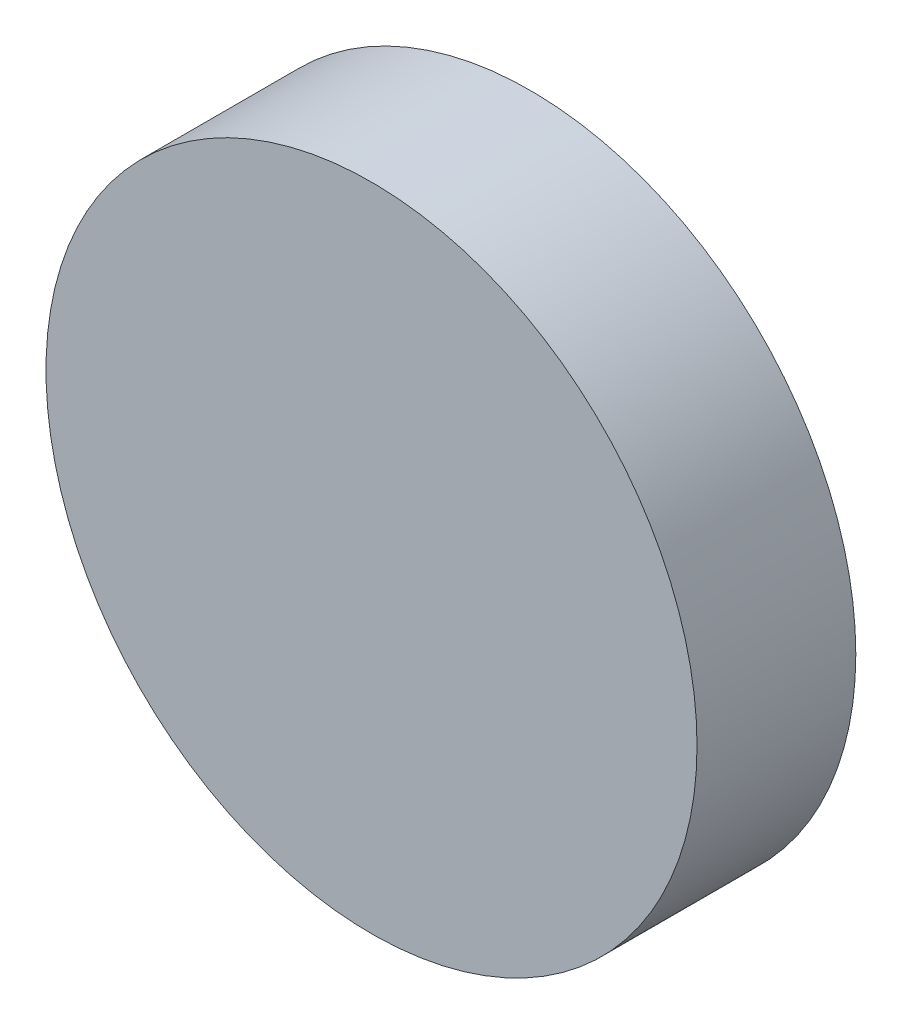
ISO-10303-21;
HEADER;
FILE_DESCRIPTION(('STEP AP214'),'2;1');
FILE_NAME('part.step','',(''),(''),'','','');
FILE_SCHEMA(('AUTOMOTIVE_DESIGN { 1 0 10303 214 1 1 1 1 }'));
ENDSEC;
DATA;
#1=APPLICATION_CONTEXT('core data for automotive mechanical design processes');
#2=APPLICATION_PROTOCOL_DEFINITION('international standard','automotive_design',2000,#1);
#3=PRODUCT_CONTEXT('',#1,'mechanical');
#4=PRODUCT('Part','Part','',(#3));
#5=PRODUCT_RELATED_PRODUCT_CATEGORY('part','',(#4));
#6=PRODUCT_DEFINITION_FORMATION('','',#4);
#7=PRODUCT_DEFINITION_CONTEXT('part definition',#1,'design');
#8=PRODUCT_DEFINITION('design','',#6,#7);
#9=PRODUCT_DEFINITION_SHAPE('','',#8);
#10=(LENGTH_UNIT() NAMED_UNIT(*) SI_UNIT(.MILLI.,.METRE.));
#11=(NAMED_UNIT(*) PLANE_ANGLE_UNIT() SI_UNIT($,.RADIAN.));
#12=(NAMED_UNIT(*) SI_UNIT($,.STERADIAN.) SOLID_ANGLE_UNIT());
#13=UNCERTAINTY_MEASURE_WITH_UNIT(LENGTH_MEASURE(1.E-05),#10,'distance_accuracy_value','');
#14=(GEOMETRIC_REPRESENTATION_CONTEXT(3) GLOBAL_UNCERTAINTY_ASSIGNED_CONTEXT((#13)) GLOBAL_UNIT_ASSIGNED_CONTEXT((#10,
#11,#12)) REPRESENTATION_CONTEXT('',''));
#15=CARTESIAN_POINT('',(0.,0.,0.));
#16=DIRECTION('',(0.,0.,1.));
#17=DIRECTION('',(1.,0.,0.));
#18=AXIS2_PLACEMENT_3D('',#15,#16,#17);
#19=CARTESIAN_POINT('',(0.,0.,15.));
#20=DIRECTION('',(0.,0.,-1.));
#21=DIRECTION('',(-1.,0.,0.));
#22=AXIS2_PLACEMENT_3D('',#19,#20,#21);
#23=CYLINDRICAL_SURFACE('',#22,61.5);
#24=CARTESIAN_POINT('',(0.,0.,15.));
#25=DIRECTION('',(0.,0.,1.));
#26=DIRECTION('',(1.,0.,0.));
#27=AXIS2_PLACEMENT_3D('',#24,#25,#26);
#28=CIRCLE('',#27,61.5);
#29=CARTESIAN_POINT('',(61.5,0.,15.));
#30=VERTEX_POINT('',#29);
#31=EDGE_CURVE('E10',#30,#30,#28,.T.);
#32=ORIENTED_EDGE('',*,*,#31,.F.);
#33=EDGE_LOOP('',(#32));
#34=FACE_BOUND('',#33,.T.);
#35=CARTESIAN_POINT('',(0.,0.,-15.));
#36=DIRECTION('',(0.,0.,1.));
#37=DIRECTION('',(1.,0.,0.));
#38=AXIS2_PLACEMENT_3D('',#35,#36,#37);
#39=CIRCLE('',#38,61.5);
#40=CARTESIAN_POINT('',(61.5,0.,-15.));
#41=VERTEX_POINT('',#40);
#42=EDGE_CURVE('E52',#41,#41,#39,.T.);
#43=ORIENTED_EDGE('',*,*,#42,.T.);
#44=EDGE_LOOP('',(#43));
#45=FACE_BOUND('',#44,.T.);
#46=ADVANCED_FACE('F49',(#34,#45),#23,.T.);
#47=CARTESIAN_POINT('',(0.,0.,15.));
#48=DIRECTION('',(0.,0.,1.));
#49=DIRECTION('',(1.,0.,0.));
#50=AXIS2_PLACEMENT_3D('',#47,#48,#49);
#51=PLANE('',#50);
#52=ORIENTED_EDGE('',*,*,#31,.T.);
#53=EDGE_LOOP('',(#52));
#54=FACE_BOUND('',#53,.T.);
#55=ADVANCED_FACE('F66',(#54),#51,.T.);
#56=CARTESIAN_POINT('',(0.,0.,-15.));
#57=DIRECTION('',(0.,0.,1.));
#58=DIRECTION('',(1.,0.,0.));
#59=AXIS2_PLACEMENT_3D('',#56,#57,#58);
#60=PLANE('',#59);
#61=ORIENTED_EDGE('',*,*,#42,.F.);
#62=EDGE_LOOP('',(#61));
#63=FACE_BOUND('',#62,.T.);
#64=ADVANCED_FACE('F64',(#63),#60,.F.);
#65=CLOSED_SHELL('',(#46,#55,#64));
#66=MANIFOLD_SOLID_BREP('B2',#65);
#67=ADVANCED_BREP_SHAPE_REPRESENTATION('',(#18,#66),#14);
#68=SHAPE_DEFINITION_REPRESENTATION(#9,#67);
ENDSEC;
END-ISO-10303-21;
